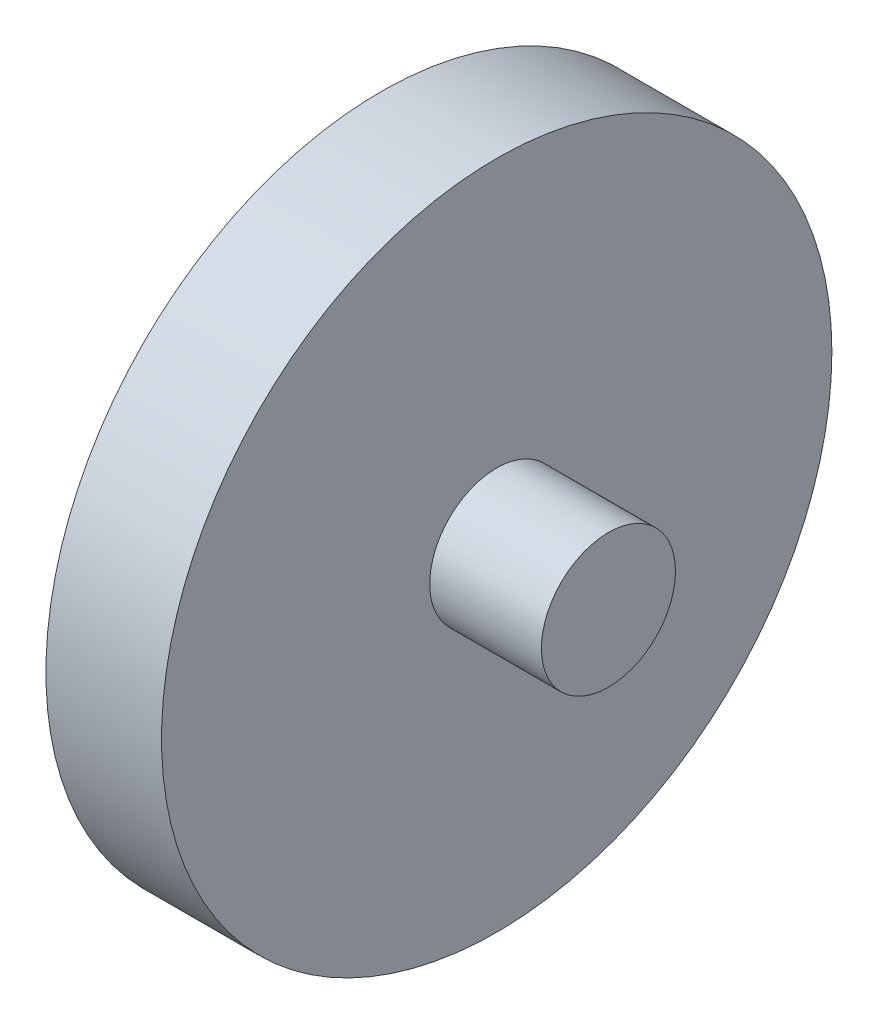
ISO-10303-21;
HEADER;
FILE_DESCRIPTION(('STEP AP214'),'2;1');
FILE_NAME('part.step','',(''),(''),'','','');
FILE_SCHEMA(('AUTOMOTIVE_DESIGN { 1 0 10303 214 1 1 1 1 }'));
ENDSEC;
DATA;
#1=APPLICATION_CONTEXT('core data for automotive mechanical design processes');
#2=APPLICATION_PROTOCOL_DEFINITION('international standard','automotive_design',2000,#1);
#3=PRODUCT_CONTEXT('',#1,'mechanical');
#4=PRODUCT('Part','Part','',(#3));
#5=PRODUCT_RELATED_PRODUCT_CATEGORY('part','',(#4));
#6=PRODUCT_DEFINITION_FORMATION('','',#4);
#7=PRODUCT_DEFINITION_CONTEXT('part definition',#1,'design');
#8=PRODUCT_DEFINITION('design','',#6,#7);
#9=PRODUCT_DEFINITION_SHAPE('','',#8);
#10=(LENGTH_UNIT() NAMED_UNIT(*) SI_UNIT(.MILLI.,.METRE.));
#11=(NAMED_UNIT(*) PLANE_ANGLE_UNIT() SI_UNIT($,.RADIAN.));
#12=(NAMED_UNIT(*) SI_UNIT($,.STERADIAN.) SOLID_ANGLE_UNIT());
#13=UNCERTAINTY_MEASURE_WITH_UNIT(LENGTH_MEASURE(1.E-05),#10,'distance_accuracy_value','');
#14=(GEOMETRIC_REPRESENTATION_CONTEXT(3) GLOBAL_UNCERTAINTY_ASSIGNED_CONTEXT((#13)) GLOBAL_UNIT_ASSIGNED_CONTEXT((#10,
#11,#12)) REPRESENTATION_CONTEXT('',''));
#15=CARTESIAN_POINT('',(0.,0.,0.));
#16=DIRECTION('',(0.,0.,1.));
#17=DIRECTION('',(1.,0.,0.));
#18=AXIS2_PLACEMENT_3D('',#15,#16,#17);
#19=CARTESIAN_POINT('',(0.,0.,0.));
#20=DIRECTION('',(1.,0.,0.));
#21=DIRECTION('',(0.,0.,-1.));
#22=AXIS2_PLACEMENT_3D('',#19,#20,#21);
#23=PLANE('',#22);
#24=CARTESIAN_POINT('',(0.,0.,0.));
#25=DIRECTION('',(1.,0.,0.));
#26=DIRECTION('',(0.,0.,-1.));
#27=AXIS2_PLACEMENT_3D('',#24,#25,#26);
#28=CIRCLE('',#27,15.);
#29=CARTESIAN_POINT('',(0.,0.,-15.));
#30=VERTEX_POINT('',#29);
#31=EDGE_CURVE('E43',#30,#30,#28,.T.);
#32=ORIENTED_EDGE('',*,*,#31,.F.);
#33=EDGE_LOOP('',(#32));
#34=FACE_BOUND('',#33,.T.);
#35=DIRECTION('',(0.,-1.,0.));
#36=VECTOR('',#35,1.);
#37=CARTESIAN_POINT('',(0.,8.35,1.5875));
#38=LINE('',#37,#36);
#39=CARTESIAN_POINT('',(0.,8.35,1.5875));
#40=VERTEX_POINT('',#39);
#41=CARTESIAN_POINT('',(0.,-8.35,1.5875));
#42=VERTEX_POINT('',#41);
#43=EDGE_CURVE('E64',#40,#42,#38,.T.);
#44=ORIENTED_EDGE('',*,*,#43,.T.);
#45=DIRECTION('',(0.,0.,-1.));
#46=VECTOR('',#45,1.);
#47=CARTESIAN_POINT('',(0.,-8.35,1.5875));
#48=LINE('',#47,#46);
#49=CARTESIAN_POINT('',(0.,-8.35,-1.5875));
#50=VERTEX_POINT('',#49);
#51=EDGE_CURVE('E120',#42,#50,#48,.T.);
#52=ORIENTED_EDGE('',*,*,#51,.T.);
#53=DIRECTION('',(0.,1.,0.));
#54=VECTOR('',#53,1.);
#55=CARTESIAN_POINT('',(0.,8.35,-1.5875));
#56=LINE('',#55,#54);
#57=CARTESIAN_POINT('',(0.,8.35,-1.5875));
#58=VERTEX_POINT('',#57);
#59=EDGE_CURVE('E102',#50,#58,#56,.T.);
#60=ORIENTED_EDGE('',*,*,#59,.T.);
#61=DIRECTION('',(0.,0.,1.));
#62=VECTOR('',#61,1.);
#63=CARTESIAN_POINT('',(0.,8.35,1.5875));
#64=LINE('',#63,#62);
#65=EDGE_CURVE('E114',#58,#40,#64,.T.);
#66=ORIENTED_EDGE('',*,*,#65,.T.);
#67=EDGE_LOOP('',(#44,#52,#60,#66));
#68=FACE_BOUND('',#67,.T.);
#69=ADVANCED_FACE('F39',(#34,#68),#23,.F.);
#70=CARTESIAN_POINT('',(4.175,0.,0.));
#71=DIRECTION('',(-1.,0.,0.));
#72=DIRECTION('',(0.,0.,1.));
#73=AXIS2_PLACEMENT_3D('',#70,#71,#72);
#74=CYLINDRICAL_SURFACE('',#73,15.);
#75=ORIENTED_EDGE('',*,*,#31,.T.);
#76=EDGE_LOOP('',(#75));
#77=FACE_BOUND('',#76,.T.);
#78=CARTESIAN_POINT('',(5.175,0.,0.));
#79=DIRECTION('',(1.,0.,0.));
#80=DIRECTION('',(0.,0.,-1.));
#81=AXIS2_PLACEMENT_3D('',#78,#79,#80);
#82=CIRCLE('',#81,15.);
#83=CARTESIAN_POINT('',(5.175,0.,-15.));
#84=VERTEX_POINT('',#83);
#85=EDGE_CURVE('E125',#84,#84,#82,.T.);
#86=ORIENTED_EDGE('',*,*,#85,.F.);
#87=EDGE_LOOP('',(#86));
#88=FACE_BOUND('',#87,.T.);
#89=ADVANCED_FACE('F41',(#77,#88),#74,.T.);
#90=CARTESIAN_POINT('',(4.175,8.35,1.5875));
#91=DIRECTION('',(0.,0.,-1.));
#92=DIRECTION('',(-1.,0.,0.));
#93=AXIS2_PLACEMENT_3D('',#90,#91,#92);
#94=PLANE('',#93);
#95=ORIENTED_EDGE('',*,*,#43,.F.);
#96=DIRECTION('',(-1.,0.,0.));
#97=VECTOR('',#96,1.);
#98=CARTESIAN_POINT('',(4.175,8.35,1.5875));
#99=LINE('',#98,#97);
#100=CARTESIAN_POINT('',(4.175,8.35,1.5875));
#101=VERTEX_POINT('',#100);
#102=EDGE_CURVE('E109',#101,#40,#99,.T.);
#103=ORIENTED_EDGE('',*,*,#102,.F.);
#104=DIRECTION('',(0.,-1.,0.));
#105=VECTOR('',#104,1.);
#106=CARTESIAN_POINT('',(4.175,8.35,1.5875));
#107=LINE('',#106,#105);
#108=CARTESIAN_POINT('',(4.175,-8.35,1.5875));
#109=VERTEX_POINT('',#108);
#110=EDGE_CURVE('E98',#101,#109,#107,.T.);
#111=ORIENTED_EDGE('',*,*,#110,.T.);
#112=DIRECTION('',(-1.,0.,0.));
#113=VECTOR('',#112,1.);
#114=CARTESIAN_POINT('',(4.175,-8.35,1.5875));
#115=LINE('',#114,#113);
#116=EDGE_CURVE('E96',#109,#42,#115,.T.);
#117=ORIENTED_EDGE('',*,*,#116,.T.);
#118=EDGE_LOOP('',(#95,#103,#111,#117));
#119=FACE_BOUND('',#118,.T.);
#120=ADVANCED_FACE('F153',(#119),#94,.T.);
#121=CARTESIAN_POINT('',(4.175,-8.35,1.5875));
#122=DIRECTION('',(0.,1.,0.));
#123=DIRECTION('',(0.,0.,1.));
#124=AXIS2_PLACEMENT_3D('',#121,#122,#123);
#125=PLANE('',#124);
#126=ORIENTED_EDGE('',*,*,#51,.F.);
#127=ORIENTED_EDGE('',*,*,#116,.F.);
#128=DIRECTION('',(0.,0.,-1.));
#129=VECTOR('',#128,1.);
#130=CARTESIAN_POINT('',(4.175,-8.35,1.5875));
#131=LINE('',#130,#129);
#132=CARTESIAN_POINT('',(4.175,-8.35,-1.5875));
#133=VERTEX_POINT('',#132);
#134=EDGE_CURVE('E85',#109,#133,#131,.T.);
#135=ORIENTED_EDGE('',*,*,#134,.T.);
#136=DIRECTION('',(-1.,0.,0.));
#137=VECTOR('',#136,1.);
#138=CARTESIAN_POINT('',(4.175,-8.35,-1.5875));
#139=LINE('',#138,#137);
#140=EDGE_CURVE('E94',#133,#50,#139,.T.);
#141=ORIENTED_EDGE('',*,*,#140,.T.);
#142=EDGE_LOOP('',(#126,#127,#135,#141));
#143=FACE_BOUND('',#142,.T.);
#144=ADVANCED_FACE('F93',(#143),#125,.T.);
#145=CARTESIAN_POINT('',(4.175,8.35,-1.5875));
#146=DIRECTION('',(0.,0.,1.));
#147=DIRECTION('',(1.,0.,0.));
#148=AXIS2_PLACEMENT_3D('',#145,#146,#147);
#149=PLANE('',#148);
#150=ORIENTED_EDGE('',*,*,#59,.F.);
#151=ORIENTED_EDGE('',*,*,#140,.F.);
#152=DIRECTION('',(0.,1.,0.));
#153=VECTOR('',#152,1.);
#154=CARTESIAN_POINT('',(4.175,8.35,-1.5875));
#155=LINE('',#154,#153);
#156=CARTESIAN_POINT('',(4.175,8.35,-1.5875));
#157=VERTEX_POINT('',#156);
#158=EDGE_CURVE('E82',#133,#157,#155,.T.);
#159=ORIENTED_EDGE('',*,*,#158,.T.);
#160=DIRECTION('',(-1.,0.,0.));
#161=VECTOR('',#160,1.);
#162=CARTESIAN_POINT('',(4.175,8.35,-1.5875));
#163=LINE('',#162,#161);
#164=EDGE_CURVE('E105',#157,#58,#163,.T.);
#165=ORIENTED_EDGE('',*,*,#164,.T.);
#166=EDGE_LOOP('',(#150,#151,#159,#165));
#167=FACE_BOUND('',#166,.T.);
#168=ADVANCED_FACE('F100',(#167),#149,.T.);
#169=CARTESIAN_POINT('',(4.175,8.35,1.5875));
#170=DIRECTION('',(0.,-1.,0.));
#171=DIRECTION('',(0.,0.,-1.));
#172=AXIS2_PLACEMENT_3D('',#169,#170,#171);
#173=PLANE('',#172);
#174=ORIENTED_EDGE('',*,*,#65,.F.);
#175=ORIENTED_EDGE('',*,*,#164,.F.);
#176=DIRECTION('',(0.,0.,1.));
#177=VECTOR('',#176,1.);
#178=CARTESIAN_POINT('',(4.175,8.35,1.5875));
#179=LINE('',#178,#177);
#180=EDGE_CURVE('E56',#157,#101,#179,.T.);
#181=ORIENTED_EDGE('',*,*,#180,.T.);
#182=ORIENTED_EDGE('',*,*,#102,.T.);
#183=EDGE_LOOP('',(#174,#175,#181,#182));
#184=FACE_BOUND('',#183,.T.);
#185=ADVANCED_FACE('F167',(#184),#173,.T.);
#186=CARTESIAN_POINT('',(4.175,0.,0.));
#187=DIRECTION('',(1.,0.,0.));
#188=DIRECTION('',(0.,0.,-1.));
#189=AXIS2_PLACEMENT_3D('',#186,#187,#188);
#190=PLANE('',#189);
#191=ORIENTED_EDGE('',*,*,#134,.F.);
#192=ORIENTED_EDGE('',*,*,#110,.F.);
#193=ORIENTED_EDGE('',*,*,#180,.F.);
#194=ORIENTED_EDGE('',*,*,#158,.F.);
#195=EDGE_LOOP('',(#191,#192,#193,#194));
#196=FACE_BOUND('',#195,.T.);
#197=ADVANCED_FACE('F84',(#196),#190,.F.);
#198=CARTESIAN_POINT('',(5.175,0.,0.));
#199=DIRECTION('',(1.,0.,0.));
#200=DIRECTION('',(0.,0.,-1.));
#201=AXIS2_PLACEMENT_3D('',#198,#199,#200);
#202=PLANE('',#201);
#203=CARTESIAN_POINT('',(5.175,0.,0.));
#204=DIRECTION('',(1.,0.,0.));
#205=DIRECTION('',(0.,0.,-1.));
#206=AXIS2_PLACEMENT_3D('',#203,#204,#205);
#207=CIRCLE('',#206,3.);
#208=CARTESIAN_POINT('',(5.175,0.,-3.));
#209=VERTEX_POINT('',#208);
#210=EDGE_CURVE('E11',#209,#209,#207,.T.);
#211=ORIENTED_EDGE('',*,*,#210,.F.);
#212=EDGE_LOOP('',(#211));
#213=FACE_BOUND('',#212,.T.);
#214=ORIENTED_EDGE('',*,*,#85,.T.);
#215=EDGE_LOOP('',(#214));
#216=FACE_BOUND('',#215,.T.);
#217=ADVANCED_FACE('F143',(#213,#216),#202,.T.);
#218=CARTESIAN_POINT('',(10.175,0.,0.));
#219=DIRECTION('',(-1.,0.,0.));
#220=DIRECTION('',(0.,0.,1.));
#221=AXIS2_PLACEMENT_3D('',#218,#219,#220);
#222=CYLINDRICAL_SURFACE('',#221,3.);
#223=CARTESIAN_POINT('',(10.175,0.,0.));
#224=DIRECTION('',(1.,0.,0.));
#225=DIRECTION('',(0.,0.,-1.));
#226=AXIS2_PLACEMENT_3D('',#223,#224,#225);
#227=CIRCLE('',#226,3.);
#228=CARTESIAN_POINT('',(10.175,0.,-3.));
#229=VERTEX_POINT('',#228);
#230=EDGE_CURVE('E132',#229,#229,#227,.T.);
#231=ORIENTED_EDGE('',*,*,#230,.F.);
#232=EDGE_LOOP('',(#231));
#233=FACE_BOUND('',#232,.T.);
#234=ORIENTED_EDGE('',*,*,#210,.T.);
#235=EDGE_LOOP('',(#234));
#236=FACE_BOUND('',#235,.T.);
#237=ADVANCED_FACE('F140',(#233,#236),#222,.T.);
#238=CARTESIAN_POINT('',(10.175,0.,0.));
#239=DIRECTION('',(1.,0.,0.));
#240=DIRECTION('',(0.,0.,-1.));
#241=AXIS2_PLACEMENT_3D('',#238,#239,#240);
#242=PLANE('',#241);
#243=ORIENTED_EDGE('',*,*,#230,.T.);
#244=EDGE_LOOP('',(#243));
#245=FACE_BOUND('',#244,.T.);
#246=ADVANCED_FACE('F138',(#245),#242,.T.);
#247=CLOSED_SHELL('',(#69,#89,#120,#144,#168,#185,#197,#217,#237,#246));
#248=MANIFOLD_SOLID_BREP('B2',#247);
#249=ADVANCED_BREP_SHAPE_REPRESENTATION('',(#18,#248),#14);
#250=SHAPE_DEFINITION_REPRESENTATION(#9,#249);
ENDSEC;
END-ISO-10303-21;
